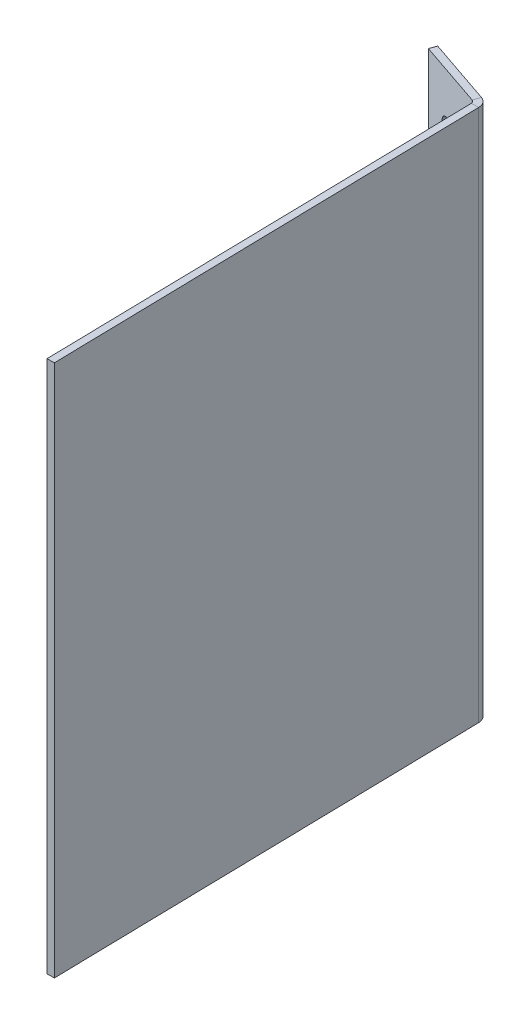
ISO-10303-21;
HEADER;
FILE_DESCRIPTION(('STEP AP214'),'2;1');
FILE_NAME('part.step','',(''),(''),'','','');
FILE_SCHEMA(('AUTOMOTIVE_DESIGN { 1 0 10303 214 1 1 1 1 }'));
ENDSEC;
DATA;
#1=APPLICATION_CONTEXT('core data for automotive mechanical design processes');
#2=APPLICATION_PROTOCOL_DEFINITION('international standard','automotive_design',2000,#1);
#3=PRODUCT_CONTEXT('',#1,'mechanical');
#4=PRODUCT('Part','Part','',(#3));
#5=PRODUCT_RELATED_PRODUCT_CATEGORY('part','',(#4));
#6=PRODUCT_DEFINITION_FORMATION('','',#4);
#7=PRODUCT_DEFINITION_CONTEXT('part definition',#1,'design');
#8=PRODUCT_DEFINITION('design','',#6,#7);
#9=PRODUCT_DEFINITION_SHAPE('','',#8);
#10=(LENGTH_UNIT() NAMED_UNIT(*) SI_UNIT(.MILLI.,.METRE.));
#11=(NAMED_UNIT(*) PLANE_ANGLE_UNIT() SI_UNIT($,.RADIAN.));
#12=(NAMED_UNIT(*) SI_UNIT($,.STERADIAN.) SOLID_ANGLE_UNIT());
#13=UNCERTAINTY_MEASURE_WITH_UNIT(LENGTH_MEASURE(1.E-05),#10,'distance_accuracy_value','');
#14=(GEOMETRIC_REPRESENTATION_CONTEXT(3) GLOBAL_UNCERTAINTY_ASSIGNED_CONTEXT((#13)) GLOBAL_UNIT_ASSIGNED_CONTEXT((#10,
#11,#12)) REPRESENTATION_CONTEXT('',''));
#15=CARTESIAN_POINT('',(0.,0.,0.));
#16=DIRECTION('',(0.,0.,1.));
#17=DIRECTION('',(1.,0.,0.));
#18=AXIS2_PLACEMENT_3D('',#15,#16,#17);
#19=CARTESIAN_POINT('',(-2.35448702329418,110.,-90.1469647888486));
#20=DIRECTION('',(0.,1.,0.));
#21=DIRECTION('',(0.,0.,1.));
#22=AXIS2_PLACEMENT_3D('',#19,#20,#21);
#23=PLANE('',#22);
#24=DIRECTION('',(0.322460871920296,0.,-0.946582794096957));
#25=VECTOR('',#24,1.);
#26=CARTESIAN_POINT('',(-2.35448702329418,110.,-90.1469647888486));
#27=LINE('',#26,#25);
#28=CARTESIAN_POINT('',(-2.35448702329418,110.,-90.1469647888486));
#29=VERTEX_POINT('',#28);
#30=CARTESIAN_POINT('',(-1.87079571541374,110.,-91.566838979994));
#31=VERTEX_POINT('',#30);
#32=EDGE_CURVE('E13',#29,#31,#27,.T.);
#33=ORIENTED_EDGE('',*,*,#32,.F.);
#34=CARTESIAN_POINT('',(-2.59201170155067,110.,-89.4497119027168));
#35=DIRECTION('',(0.,-1.,0.));
#36=DIRECTION('',(0.,0.,-1.));
#37=AXIS2_PLACEMENT_3D('',#34,#35,#36);
#38=CIRCLE('',#37,0.7366);
#39=CARTESIAN_POINT('',(-1.85557008513026,110.,-89.4649862473536));
#40=VERTEX_POINT('',#39);
#41=EDGE_CURVE('E146',#40,#29,#38,.F.);
#42=ORIENTED_EDGE('',*,*,#41,.F.);
#43=DIRECTION('',(-0.999784980206918,0.,0.0207362810709285));
#44=VECTOR('',#43,1.);
#45=CARTESIAN_POINT('',(-0.35589261481988,110.,-89.49609066896));
#46=LINE('',#45,#44);
#47=CARTESIAN_POINT('',(-0.35589261481988,110.,-89.49609066896));
#48=VERTEX_POINT('',#47);
#49=EDGE_CURVE('E57',#48,#40,#46,.T.);
#50=ORIENTED_EDGE('',*,*,#49,.F.);
#51=CARTESIAN_POINT('',(-2.59201170155067,110.,-89.4497119027168));
#52=DIRECTION('',(0.,1.,0.));
#53=DIRECTION('',(1.,0.,0.));
#54=AXIS2_PLACEMENT_3D('',#51,#52,#53);
#55=CIRCLE('',#54,2.2366);
#56=EDGE_CURVE('E139',#48,#31,#55,.T.);
#57=ORIENTED_EDGE('',*,*,#56,.T.);
#58=EDGE_LOOP('',(#33,#42,#50,#57));
#59=FACE_BOUND('',#58,.T.);
#60=ADVANCED_FACE('F49',(#59),#23,.T.);
#61=CARTESIAN_POINT('',(-0.35589261481988,110.,-89.49609066896));
#62=DIRECTION('',(0.,1.,0.));
#63=DIRECTION('',(0.,0.,1.));
#64=AXIS2_PLACEMENT_3D('',#61,#62,#63);
#65=PLANE('',#64);
#66=DIRECTION('',(-0.946582794096957,0.,-0.322460871920296));
#67=VECTOR('',#66,1.);
#68=CARTESIAN_POINT('',(-1.86626529638621,110.,-89.9806482186226));
#69=LINE('',#68,#67);
#70=CARTESIAN_POINT('',(-16.0650072078406,110.,-94.817561297427));
#71=VERTEX_POINT('',#70);
#72=EDGE_CURVE('E196',#29,#71,#69,.T.);
#73=ORIENTED_EDGE('',*,*,#72,.F.);
#74=ORIENTED_EDGE('',*,*,#32,.T.);
#75=DIRECTION('',(-0.946582794096957,0.,-0.322460871920296));
#76=VECTOR('',#75,1.);
#77=CARTESIAN_POINT('',(-1.38257398850576,110.,-91.400522409768));
#78=LINE('',#77,#76);
#79=CARTESIAN_POINT('',(-15.5813158999601,110.,-96.2374354885725));
#80=VERTEX_POINT('',#79);
#81=EDGE_CURVE('E105',#31,#80,#78,.T.);
#82=ORIENTED_EDGE('',*,*,#81,.T.);
#83=DIRECTION('',(0.322460871920296,0.,-0.946582794096957));
#84=VECTOR('',#83,1.);
#85=CARTESIAN_POINT('',(-16.0650072078406,110.,-94.817561297427));
#86=LINE('',#85,#84);
#87=EDGE_CURVE('E369',#71,#80,#86,.T.);
#88=ORIENTED_EDGE('',*,*,#87,.F.);
#89=EDGE_LOOP('',(#73,#74,#82,#88));
#90=FACE_BOUND('',#89,.T.);
#91=ADVANCED_FACE('F204',(#90),#65,.T.);
#92=CARTESIAN_POINT('',(-1.85557008513026,0.,-89.4649862473536));
#93=DIRECTION('',(0.,-1.,0.));
#94=DIRECTION('',(0.,0.,-1.));
#95=AXIS2_PLACEMENT_3D('',#92,#93,#94);
#96=PLANE('',#95);
#97=DIRECTION('',(0.999784980206918,0.,-0.0207362810709285));
#98=VECTOR('',#97,1.);
#99=CARTESIAN_POINT('',(-1.85557008513026,0.,-89.4649862473536));
#100=LINE('',#99,#98);
#101=CARTESIAN_POINT('',(-1.85557008513026,0.,-89.4649862473536));
#102=VERTEX_POINT('',#101);
#103=CARTESIAN_POINT('',(-0.35589261481988,0.,-89.49609066896));
#104=VERTEX_POINT('',#103);
#105=EDGE_CURVE('E92',#102,#104,#100,.T.);
#106=ORIENTED_EDGE('',*,*,#105,.F.);
#107=CARTESIAN_POINT('',(-2.59201170155067,0.,-89.4497119027168));
#108=DIRECTION('',(0.,-1.,0.));
#109=DIRECTION('',(0.,0.,-1.));
#110=AXIS2_PLACEMENT_3D('',#107,#108,#109);
#111=CIRCLE('',#110,0.7366);
#112=CARTESIAN_POINT('',(-2.35448702329418,0.,-90.1469647888486));
#113=VERTEX_POINT('',#112);
#114=EDGE_CURVE('E162',#102,#113,#111,.F.);
#115=ORIENTED_EDGE('',*,*,#114,.T.);
#116=DIRECTION('',(-0.322460871920296,0.,0.946582794096957));
#117=VECTOR('',#116,1.);
#118=CARTESIAN_POINT('',(-1.87079571541374,0.,-91.566838979994));
#119=LINE('',#118,#117);
#120=CARTESIAN_POINT('',(-1.87079571541374,0.,-91.566838979994));
#121=VERTEX_POINT('',#120);
#122=EDGE_CURVE('E99',#121,#113,#119,.T.);
#123=ORIENTED_EDGE('',*,*,#122,.F.);
#124=CARTESIAN_POINT('',(-2.59201170155067,0.,-89.4497119027168));
#125=DIRECTION('',(0.,1.,0.));
#126=DIRECTION('',(1.,0.,0.));
#127=AXIS2_PLACEMENT_3D('',#124,#125,#126);
#128=CIRCLE('',#127,2.2366);
#129=EDGE_CURVE('E169',#104,#121,#128,.T.);
#130=ORIENTED_EDGE('',*,*,#129,.F.);
#131=EDGE_LOOP('',(#106,#115,#123,#130));
#132=FACE_BOUND('',#131,.T.);
#133=ADVANCED_FACE('F202',(#132),#96,.T.);
#134=CARTESIAN_POINT('',(-1.87079571541374,0.,-91.566838979994));
#135=DIRECTION('',(0.,-1.,0.));
#136=DIRECTION('',(0.,0.,-1.));
#137=AXIS2_PLACEMENT_3D('',#134,#135,#136);
#138=PLANE('',#137);
#139=DIRECTION('',(-0.0207362810709579,0.,-0.999784980206917));
#140=VECTOR('',#139,1.);
#141=CARTESIAN_POINT('',(0.,0.,0.));
#142=LINE('',#141,#140);
#143=CARTESIAN_POINT('',(0.,0.,0.));
#144=VERTEX_POINT('',#143);
#145=EDGE_CURVE('E164',#144,#102,#142,.T.);
#146=ORIENTED_EDGE('',*,*,#145,.T.);
#147=ORIENTED_EDGE('',*,*,#105,.T.);
#148=DIRECTION('',(-0.0207362810709579,0.,-0.999784980206917));
#149=VECTOR('',#148,1.);
#150=CARTESIAN_POINT('',(1.49967747031038,0.,-0.0311044216064368));
#151=LINE('',#150,#149);
#152=CARTESIAN_POINT('',(1.49967747031038,0.,-0.0311044216064368));
#153=VERTEX_POINT('',#152);
#154=EDGE_CURVE('E167',#153,#104,#151,.T.);
#155=ORIENTED_EDGE('',*,*,#154,.F.);
#156=DIRECTION('',(-0.999784980206917,0.,0.0207362810709579));
#157=VECTOR('',#156,1.);
#158=CARTESIAN_POINT('',(1.49967747031038,0.,-0.0311044216064368));
#159=LINE('',#158,#157);
#160=EDGE_CURVE('E127',#153,#144,#159,.T.);
#161=ORIENTED_EDGE('',*,*,#160,.T.);
#162=EDGE_LOOP('',(#146,#147,#155,#161));
#163=FACE_BOUND('',#162,.T.);
#164=ADVANCED_FACE('F198',(#163),#138,.T.);
#165=CARTESIAN_POINT('',(-1.38257398850576,110.,-91.400522409768));
#166=DIRECTION('',(-0.322460871920297,0.,0.946582794096957));
#167=DIRECTION('',(0.946582794096957,0.,0.322460871920296));
#168=AXIS2_PLACEMENT_3D('',#165,#166,#167);
#169=PLANE('',#168);
#170=CARTESIAN_POINT('',(-9.9018191353784,9.99999999999999,-94.3026702570506));
#171=DIRECTION('',(0.322460871920295,0.,-0.946582794096957));
#172=DIRECTION('',(-0.946582794096957,0.,-0.322460871920295));
#173=AXIS2_PLACEMENT_3D('',#170,#171,#172);
#174=CIRCLE('',#173,1.49999999999999);
#175=CARTESIAN_POINT('',(-11.3216933265238,9.99999999999999,-94.786361564931));
#176=VERTEX_POINT('',#175);
#177=EDGE_CURVE('E356',#176,#176,#174,.T.);
#178=ORIENTED_EDGE('',*,*,#177,.F.);
#179=EDGE_LOOP('',(#178));
#180=FACE_BOUND('',#179,.T.);
#181=CARTESIAN_POINT('',(-9.9018191353784,100.,-94.3026702570506));
#182=DIRECTION('',(0.322460871920295,0.,-0.946582794096957));
#183=DIRECTION('',(-0.946582794096957,0.,-0.322460871920295));
#184=AXIS2_PLACEMENT_3D('',#181,#182,#183);
#185=CIRCLE('',#184,1.49999999999999);
#186=CARTESIAN_POINT('',(-11.3216933265238,100.,-94.786361564931));
#187=VERTEX_POINT('',#186);
#188=EDGE_CURVE('E360',#187,#187,#185,.T.);
#189=ORIENTED_EDGE('',*,*,#188,.F.);
#190=EDGE_LOOP('',(#189));
#191=FACE_BOUND('',#190,.T.);
#192=DIRECTION('',(-0.946582794096957,0.,-0.322460871920296));
#193=VECTOR('',#192,1.);
#194=CARTESIAN_POINT('',(-1.38257398850576,0.,-91.400522409768));
#195=LINE('',#194,#193);
#196=CARTESIAN_POINT('',(-15.5813158999601,0.,-96.2374354885725));
#197=VERTEX_POINT('',#196);
#198=EDGE_CURVE('E152',#121,#197,#195,.T.);
#199=ORIENTED_EDGE('',*,*,#198,.T.);
#200=DIRECTION('',(0.,-1.,0.));
#201=VECTOR('',#200,1.);
#202=CARTESIAN_POINT('',(-15.5813158999601,110.,-96.2374354885725));
#203=LINE('',#202,#201);
#204=EDGE_CURVE('E183',#80,#197,#203,.T.);
#205=ORIENTED_EDGE('',*,*,#204,.F.);
#206=ORIENTED_EDGE('',*,*,#81,.F.);
#207=DIRECTION('',(0.,-1.,0.));
#208=VECTOR('',#207,1.);
#209=CARTESIAN_POINT('',(-1.87079571541374,110.,-91.566838979994));
#210=LINE('',#209,#208);
#211=EDGE_CURVE('E151',#31,#121,#210,.T.);
#212=ORIENTED_EDGE('',*,*,#211,.T.);
#213=EDGE_LOOP('',(#199,#205,#206,#212));
#214=FACE_BOUND('',#213,.T.);
#215=ADVANCED_FACE('F210',(#180,#191,#214),#169,.F.);
#216=CARTESIAN_POINT('',(-16.0650072078406,110.,-94.817561297427));
#217=DIRECTION('',(-0.946582794096957,0.,-0.322460871920296));
#218=DIRECTION('',(-0.322460871920296,0.,0.946582794096957));
#219=AXIS2_PLACEMENT_3D('',#216,#217,#218);
#220=PLANE('',#219);
#221=DIRECTION('',(0.322460871920296,0.,-0.946582794096957));
#222=VECTOR('',#221,1.);
#223=CARTESIAN_POINT('',(-16.0650072078406,0.,-94.817561297427));
#224=LINE('',#223,#222);
#225=CARTESIAN_POINT('',(-16.0650072078406,0.,-94.817561297427));
#226=VERTEX_POINT('',#225);
#227=EDGE_CURVE('E155',#226,#197,#224,.T.);
#228=ORIENTED_EDGE('',*,*,#227,.F.);
#229=DIRECTION('',(0.,-1.,0.));
#230=VECTOR('',#229,1.);
#231=CARTESIAN_POINT('',(-16.0650072078406,110.,-94.817561297427));
#232=LINE('',#231,#230);
#233=EDGE_CURVE('E181',#71,#226,#232,.T.);
#234=ORIENTED_EDGE('',*,*,#233,.F.);
#235=ORIENTED_EDGE('',*,*,#87,.T.);
#236=ORIENTED_EDGE('',*,*,#204,.T.);
#237=EDGE_LOOP('',(#228,#234,#235,#236));
#238=FACE_BOUND('',#237,.T.);
#239=ADVANCED_FACE('F239',(#238),#220,.T.);
#240=CARTESIAN_POINT('',(-1.86626529638621,110.,-89.9806482186226));
#241=DIRECTION('',(-0.322460871920297,0.,0.946582794096957));
#242=DIRECTION('',(0.946582794096957,0.,0.322460871920296));
#243=AXIS2_PLACEMENT_3D('',#240,#241,#242);
#244=PLANE('',#243);
#245=CARTESIAN_POINT('',(-10.3855104432588,9.99999999999999,-92.8827960659052));
#246=DIRECTION('',(-0.322460871920297,0.,0.946582794096957));
#247=DIRECTION('',(0.946582794096957,0.,0.322460871920296));
#248=AXIS2_PLACEMENT_3D('',#245,#246,#247);
#249=CIRCLE('',#248,1.49999999999999);
#250=CARTESIAN_POINT('',(-8.96563625211339,9.99999999999999,-92.3991047580248));
#251=VERTEX_POINT('',#250);
#252=EDGE_CURVE('E359',#251,#251,#249,.T.);
#253=ORIENTED_EDGE('',*,*,#252,.F.);
#254=EDGE_LOOP('',(#253));
#255=FACE_BOUND('',#254,.T.);
#256=CARTESIAN_POINT('',(-10.3855104432588,100.,-92.8827960659052));
#257=DIRECTION('',(-0.322460871920297,0.,0.946582794096957));
#258=DIRECTION('',(0.946582794096957,0.,0.322460871920296));
#259=AXIS2_PLACEMENT_3D('',#256,#257,#258);
#260=CIRCLE('',#259,1.49999999999999);
#261=CARTESIAN_POINT('',(-8.96563625211339,100.,-92.3991047580248));
#262=VERTEX_POINT('',#261);
#263=EDGE_CURVE('E156',#262,#262,#260,.T.);
#264=ORIENTED_EDGE('',*,*,#263,.F.);
#265=EDGE_LOOP('',(#264));
#266=FACE_BOUND('',#265,.T.);
#267=DIRECTION('',(-0.946582794096957,0.,-0.322460871920296));
#268=VECTOR('',#267,1.);
#269=CARTESIAN_POINT('',(-1.86626529638621,0.,-89.9806482186226));
#270=LINE('',#269,#268);
#271=EDGE_CURVE('E159',#113,#226,#270,.T.);
#272=ORIENTED_EDGE('',*,*,#271,.F.);
#273=DIRECTION('',(0.,-1.,0.));
#274=VECTOR('',#273,1.);
#275=CARTESIAN_POINT('',(-2.35448702329418,110.,-90.1469647888486));
#276=LINE('',#275,#274);
#277=EDGE_CURVE('E178',#29,#113,#276,.T.);
#278=ORIENTED_EDGE('',*,*,#277,.F.);
#279=ORIENTED_EDGE('',*,*,#72,.T.);
#280=ORIENTED_EDGE('',*,*,#233,.T.);
#281=EDGE_LOOP('',(#272,#278,#279,#280));
#282=FACE_BOUND('',#281,.T.);
#283=ADVANCED_FACE('F244',(#255,#266,#282),#244,.T.);
#284=CARTESIAN_POINT('',(-2.59201170155067,110.,-89.4497119027168));
#285=DIRECTION('',(0.,-1.,0.));
#286=DIRECTION('',(0.,0.,-1.));
#287=AXIS2_PLACEMENT_3D('',#284,#285,#286);
#288=CYLINDRICAL_SURFACE('',#287,0.7366);
#289=ORIENTED_EDGE('',*,*,#114,.F.);
#290=DIRECTION('',(0.,-1.,0.));
#291=VECTOR('',#290,1.);
#292=CARTESIAN_POINT('',(-1.85557008513026,110.,-89.4649862473536));
#293=LINE('',#292,#291);
#294=EDGE_CURVE('E175',#40,#102,#293,.T.);
#295=ORIENTED_EDGE('',*,*,#294,.F.);
#296=ORIENTED_EDGE('',*,*,#41,.T.);
#297=ORIENTED_EDGE('',*,*,#277,.T.);
#298=EDGE_LOOP('',(#289,#295,#296,#297));
#299=FACE_BOUND('',#298,.T.);
#300=ADVANCED_FACE('F192',(#299),#288,.F.);
#301=CARTESIAN_POINT('',(0.,110.,0.));
#302=DIRECTION('',(-0.999784980206917,0.,0.0207362810709579));
#303=DIRECTION('',(0.0207362810709579,0.,0.999784980206917));
#304=AXIS2_PLACEMENT_3D('',#301,#302,#303);
#305=PLANE('',#304);
#306=ORIENTED_EDGE('',*,*,#145,.F.);
#307=DIRECTION('',(0.,-1.,0.));
#308=VECTOR('',#307,1.);
#309=CARTESIAN_POINT('',(0.,110.,0.));
#310=LINE('',#309,#308);
#311=CARTESIAN_POINT('',(0.,110.,0.));
#312=VERTEX_POINT('',#311);
#313=EDGE_CURVE('E129',#312,#144,#310,.T.);
#314=ORIENTED_EDGE('',*,*,#313,.F.);
#315=DIRECTION('',(-0.0207362810709579,0.,-0.999784980206917));
#316=VECTOR('',#315,1.);
#317=CARTESIAN_POINT('',(0.,110.,0.));
#318=LINE('',#317,#316);
#319=EDGE_CURVE('E144',#312,#40,#318,.T.);
#320=ORIENTED_EDGE('',*,*,#319,.T.);
#321=ORIENTED_EDGE('',*,*,#294,.T.);
#322=EDGE_LOOP('',(#306,#314,#320,#321));
#323=FACE_BOUND('',#322,.T.);
#324=ADVANCED_FACE('F197',(#323),#305,.T.);
#325=CARTESIAN_POINT('',(1.49967747031038,110.,-0.0311044216064368));
#326=DIRECTION('',(0.0207362810709579,0.,0.999784980206918));
#327=DIRECTION('',(0.999784980206918,0.,-0.0207362810709579));
#328=AXIS2_PLACEMENT_3D('',#325,#326,#327);
#329=PLANE('',#328);
#330=ORIENTED_EDGE('',*,*,#160,.F.);
#331=DIRECTION('',(0.,-1.,0.));
#332=VECTOR('',#331,1.);
#333=CARTESIAN_POINT('',(1.49967747031038,110.,-0.0311044216064368));
#334=LINE('',#333,#332);
#335=CARTESIAN_POINT('',(1.49967747031038,110.,-0.0311044216064368));
#336=VERTEX_POINT('',#335);
#337=EDGE_CURVE('E121',#336,#153,#334,.T.);
#338=ORIENTED_EDGE('',*,*,#337,.F.);
#339=DIRECTION('',(-0.999784980206917,0.,0.0207362810709579));
#340=VECTOR('',#339,1.);
#341=CARTESIAN_POINT('',(1.49967747031038,110.,-0.0311044216064368));
#342=LINE('',#341,#340);
#343=EDGE_CURVE('E125',#336,#312,#342,.T.);
#344=ORIENTED_EDGE('',*,*,#343,.T.);
#345=ORIENTED_EDGE('',*,*,#313,.T.);
#346=EDGE_LOOP('',(#330,#338,#344,#345));
#347=FACE_BOUND('',#346,.T.);
#348=ADVANCED_FACE('F123',(#347),#329,.T.);
#349=CARTESIAN_POINT('',(1.49967747031038,110.,-0.0311044216064368));
#350=DIRECTION('',(-0.999784980206918,0.,0.0207362810709579));
#351=DIRECTION('',(0.0207362810709579,0.,0.999784980206918));
#352=AXIS2_PLACEMENT_3D('',#349,#350,#351);
#353=PLANE('',#352);
#354=ORIENTED_EDGE('',*,*,#154,.T.);
#355=DIRECTION('',(0.,-1.,0.));
#356=VECTOR('',#355,1.);
#357=CARTESIAN_POINT('',(-0.35589261481988,110.,-89.49609066896));
#358=LINE('',#357,#356);
#359=EDGE_CURVE('E130',#48,#104,#358,.T.);
#360=ORIENTED_EDGE('',*,*,#359,.F.);
#361=DIRECTION('',(-0.0207362810709579,0.,-0.999784980206917));
#362=VECTOR('',#361,1.);
#363=CARTESIAN_POINT('',(1.49967747031038,110.,-0.0311044216064368));
#364=LINE('',#363,#362);
#365=EDGE_CURVE('E134',#336,#48,#364,.T.);
#366=ORIENTED_EDGE('',*,*,#365,.F.);
#367=ORIENTED_EDGE('',*,*,#337,.T.);
#368=EDGE_LOOP('',(#354,#360,#366,#367));
#369=FACE_BOUND('',#368,.T.);
#370=ADVANCED_FACE('F135',(#369),#353,.F.);
#371=CARTESIAN_POINT('',(-2.59201170155067,110.,-89.4497119027168));
#372=DIRECTION('',(0.,-1.,0.));
#373=DIRECTION('',(0.,0.,-1.));
#374=AXIS2_PLACEMENT_3D('',#371,#372,#373);
#375=CYLINDRICAL_SURFACE('',#374,2.2366);
#376=ORIENTED_EDGE('',*,*,#129,.T.);
#377=ORIENTED_EDGE('',*,*,#211,.F.);
#378=ORIENTED_EDGE('',*,*,#56,.F.);
#379=ORIENTED_EDGE('',*,*,#359,.T.);
#380=EDGE_LOOP('',(#376,#377,#378,#379));
#381=FACE_BOUND('',#380,.T.);
#382=ADVANCED_FACE('F200',(#381),#375,.T.);
#383=CARTESIAN_POINT('',(-2.59201170155067,110.,-89.4497119027168));
#384=DIRECTION('',(0.,-1.,0.));
#385=DIRECTION('',(-1.,0.,0.));
#386=AXIS2_PLACEMENT_3D('',#383,#384,#385);
#387=PLANE('',#386);
#388=ORIENTED_EDGE('',*,*,#365,.T.);
#389=ORIENTED_EDGE('',*,*,#49,.T.);
#390=ORIENTED_EDGE('',*,*,#319,.F.);
#391=ORIENTED_EDGE('',*,*,#343,.F.);
#392=EDGE_LOOP('',(#388,#389,#390,#391));
#393=FACE_BOUND('',#392,.T.);
#394=ADVANCED_FACE('F142',(#393),#387,.F.);
#395=CARTESIAN_POINT('',(-2.59201170155067,0.,-89.4497119027168));
#396=DIRECTION('',(0.,-1.,0.));
#397=DIRECTION('',(-1.,0.,0.));
#398=AXIS2_PLACEMENT_3D('',#395,#396,#397);
#399=PLANE('',#398);
#400=ORIENTED_EDGE('',*,*,#198,.F.);
#401=ORIENTED_EDGE('',*,*,#122,.T.);
#402=ORIENTED_EDGE('',*,*,#271,.T.);
#403=ORIENTED_EDGE('',*,*,#227,.T.);
#404=EDGE_LOOP('',(#400,#401,#402,#403));
#405=FACE_BOUND('',#404,.T.);
#406=ADVANCED_FACE('F302',(#405),#399,.T.);
#407=CARTESIAN_POINT('',(-9.9018191353784,100.,-94.3026702570506));
#408=DIRECTION('',(0.322460871920295,0.,-0.946582794096957));
#409=DIRECTION('',(-0.946582794096957,0.,-0.322460871920295));
#410=AXIS2_PLACEMENT_3D('',#407,#408,#409);
#411=CYLINDRICAL_SURFACE('',#410,1.49999999999999);
#412=ORIENTED_EDGE('',*,*,#188,.T.);
#413=EDGE_LOOP('',(#412));
#414=FACE_BOUND('',#413,.T.);
#415=ORIENTED_EDGE('',*,*,#263,.T.);
#416=EDGE_LOOP('',(#415));
#417=FACE_BOUND('',#416,.T.);
#418=ADVANCED_FACE('F312',(#414,#417),#411,.F.);
#419=CARTESIAN_POINT('',(-9.9018191353784,9.99999999999999,-94.3026702570506));
#420=DIRECTION('',(0.322460871920295,0.,-0.946582794096957));
#421=DIRECTION('',(-0.946582794096957,0.,-0.322460871920295));
#422=AXIS2_PLACEMENT_3D('',#419,#420,#421);
#423=CYLINDRICAL_SURFACE('',#422,1.49999999999999);
#424=ORIENTED_EDGE('',*,*,#177,.T.);
#425=EDGE_LOOP('',(#424));
#426=FACE_BOUND('',#425,.T.);
#427=ORIENTED_EDGE('',*,*,#252,.T.);
#428=EDGE_LOOP('',(#427));
#429=FACE_BOUND('',#428,.T.);
#430=ADVANCED_FACE('F339',(#426,#429),#423,.F.);
#431=CLOSED_SHELL('',(#60,#91,#133,#164,#215,#239,#283,#300,#324,#348,#370,#382,#394,#406,#418,#430));
#432=MANIFOLD_SOLID_BREP('B2',#431);
#433=ADVANCED_BREP_SHAPE_REPRESENTATION('',(#18,#432),#14);
#434=SHAPE_DEFINITION_REPRESENTATION(#9,#433);
ENDSEC;
END-ISO-10303-21;
